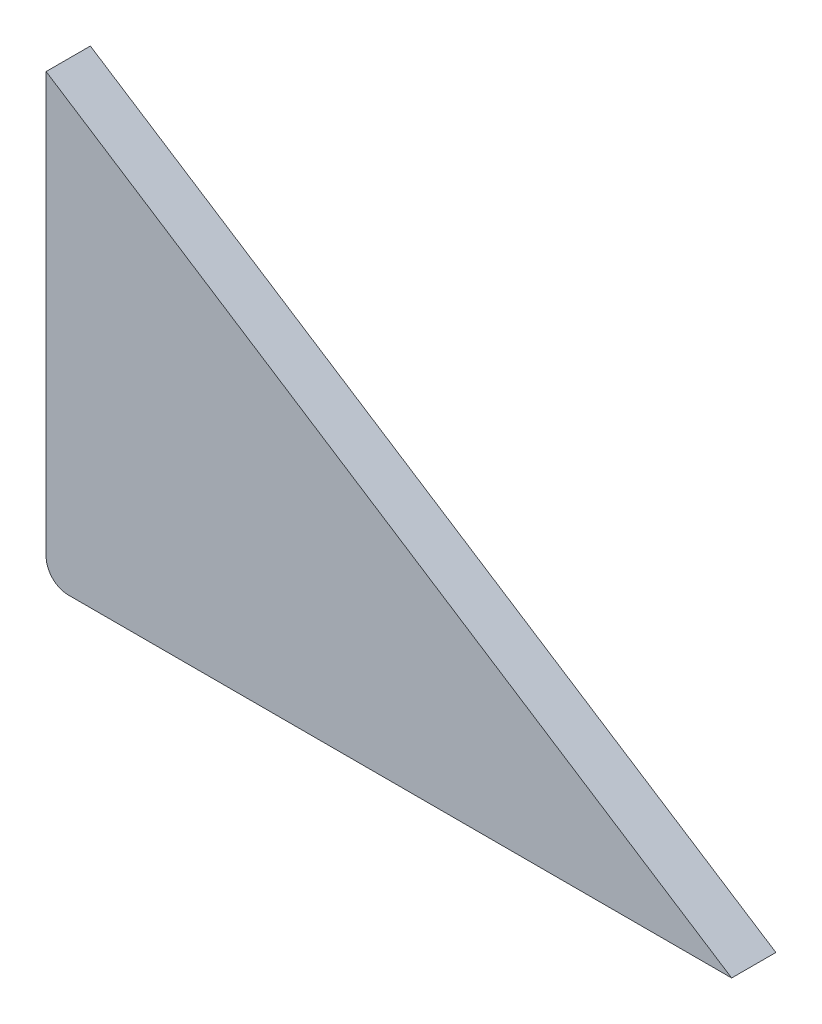
ISO-10303-21;
HEADER;
FILE_DESCRIPTION(('STEP AP214'),'2;1');
FILE_NAME('part.step','',(''),(''),'','','');
FILE_SCHEMA(('AUTOMOTIVE_DESIGN { 1 0 10303 214 1 1 1 1 }'));
ENDSEC;
DATA;
#1=APPLICATION_CONTEXT('core data for automotive mechanical design processes');
#2=APPLICATION_PROTOCOL_DEFINITION('international standard','automotive_design',2000,#1);
#3=PRODUCT_CONTEXT('',#1,'mechanical');
#4=PRODUCT('Part','Part','',(#3));
#5=PRODUCT_RELATED_PRODUCT_CATEGORY('part','',(#4));
#6=PRODUCT_DEFINITION_FORMATION('','',#4);
#7=PRODUCT_DEFINITION_CONTEXT('part definition',#1,'design');
#8=PRODUCT_DEFINITION('design','',#6,#7);
#9=PRODUCT_DEFINITION_SHAPE('','',#8);
#10=(LENGTH_UNIT() NAMED_UNIT(*) SI_UNIT(.MILLI.,.METRE.));
#11=(NAMED_UNIT(*) PLANE_ANGLE_UNIT() SI_UNIT($,.RADIAN.));
#12=(NAMED_UNIT(*) SI_UNIT($,.STERADIAN.) SOLID_ANGLE_UNIT());
#13=UNCERTAINTY_MEASURE_WITH_UNIT(LENGTH_MEASURE(1.E-05),#10,'distance_accuracy_value','');
#14=(GEOMETRIC_REPRESENTATION_CONTEXT(3) GLOBAL_UNCERTAINTY_ASSIGNED_CONTEXT((#13)) GLOBAL_UNIT_ASSIGNED_CONTEXT((#10,
#11,#12)) REPRESENTATION_CONTEXT('',''));
#15=CARTESIAN_POINT('',(0.,0.,0.));
#16=DIRECTION('',(0.,0.,1.));
#17=DIRECTION('',(1.,0.,0.));
#18=AXIS2_PLACEMENT_3D('',#15,#16,#17);
#19=CARTESIAN_POINT('',(0.,63.5,6.34999999999997));
#20=DIRECTION('',(1.,0.,0.));
#21=DIRECTION('',(0.,1.,0.));
#22=AXIS2_PLACEMENT_3D('',#19,#20,#21);
#23=PLANE('',#22);
#24=DIRECTION('',(0.,-1.,0.));
#25=VECTOR('',#24,1.);
#26=CARTESIAN_POINT('',(0.,63.5,0.));
#27=LINE('',#26,#25);
#28=CARTESIAN_POINT('',(0.,63.5,0.));
#29=VERTEX_POINT('',#28);
#30=CARTESIAN_POINT('',(0.,3.17499999999998,0.));
#31=VERTEX_POINT('',#30);
#32=EDGE_CURVE('E114',#29,#31,#27,.T.);
#33=ORIENTED_EDGE('',*,*,#32,.T.);
#34=DIRECTION('',(0.,0.,-1.));
#35=VECTOR('',#34,1.);
#36=CARTESIAN_POINT('',(0.,3.17499999999998,6.34999999999997));
#37=LINE('',#36,#35);
#38=CARTESIAN_POINT('',(0.,3.17499999999998,6.34999999999997));
#39=VERTEX_POINT('',#38);
#40=EDGE_CURVE('E49',#31,#39,#37,.F.);
#41=ORIENTED_EDGE('',*,*,#40,.T.);
#42=DIRECTION('',(0.,-1.,0.));
#43=VECTOR('',#42,1.);
#44=CARTESIAN_POINT('',(0.,63.5,6.34999999999997));
#45=LINE('',#44,#43);
#46=CARTESIAN_POINT('',(0.,63.5,6.34999999999997));
#47=VERTEX_POINT('',#46);
#48=EDGE_CURVE('E92',#47,#39,#45,.T.);
#49=ORIENTED_EDGE('',*,*,#48,.F.);
#50=DIRECTION('',(0.,0.,-1.));
#51=VECTOR('',#50,1.);
#52=CARTESIAN_POINT('',(0.,63.5,6.34999999999997));
#53=LINE('',#52,#51);
#54=EDGE_CURVE('E102',#47,#29,#53,.T.);
#55=ORIENTED_EDGE('',*,*,#54,.T.);
#56=EDGE_LOOP('',(#33,#41,#49,#55));
#57=FACE_BOUND('',#56,.T.);
#58=ADVANCED_FACE('F40',(#57),#23,.F.);
#59=CARTESIAN_POINT('',(0.,0.,6.34999999999997));
#60=DIRECTION('',(0.,1.,0.));
#61=DIRECTION('',(0.,0.,1.));
#62=AXIS2_PLACEMENT_3D('',#59,#60,#61);
#63=PLANE('',#62);
#64=DIRECTION('',(1.,0.,0.));
#65=VECTOR('',#64,1.);
#66=CARTESIAN_POINT('',(0.,0.,6.34999999999997));
#67=LINE('',#66,#65);
#68=CARTESIAN_POINT('',(3.175,0.,6.34999999999997));
#69=VERTEX_POINT('',#68);
#70=CARTESIAN_POINT('',(98.425,0.,6.34999999999997));
#71=VERTEX_POINT('',#70);
#72=EDGE_CURVE('E81',#69,#71,#67,.T.);
#73=ORIENTED_EDGE('',*,*,#72,.F.);
#74=DIRECTION('',(0.,0.,-1.));
#75=VECTOR('',#74,1.);
#76=CARTESIAN_POINT('',(3.175,0.,6.34999999999997));
#77=LINE('',#76,#75);
#78=CARTESIAN_POINT('',(3.175,0.,0.));
#79=VERTEX_POINT('',#78);
#80=EDGE_CURVE('E101',#69,#79,#77,.T.);
#81=ORIENTED_EDGE('',*,*,#80,.T.);
#82=DIRECTION('',(1.,0.,0.));
#83=VECTOR('',#82,1.);
#84=CARTESIAN_POINT('',(0.,0.,0.));
#85=LINE('',#84,#83);
#86=CARTESIAN_POINT('',(98.425,0.,0.));
#87=VERTEX_POINT('',#86);
#88=EDGE_CURVE('E97',#79,#87,#85,.T.);
#89=ORIENTED_EDGE('',*,*,#88,.T.);
#90=DIRECTION('',(0.,0.,-1.));
#91=VECTOR('',#90,1.);
#92=CARTESIAN_POINT('',(98.425,0.,6.34999999999997));
#93=LINE('',#92,#91);
#94=EDGE_CURVE('E95',#71,#87,#93,.T.);
#95=ORIENTED_EDGE('',*,*,#94,.F.);
#96=EDGE_LOOP('',(#73,#81,#89,#95));
#97=FACE_BOUND('',#96,.T.);
#98=ADVANCED_FACE('F96',(#97),#63,.F.);
#99=CARTESIAN_POINT('',(98.425,0.,6.34999999999997));
#100=DIRECTION('',(-0.542126869822093,-0.840296648224244,0.));
#101=DIRECTION('',(0.840296648224244,-0.542126869822093,0.));
#102=AXIS2_PLACEMENT_3D('',#99,#100,#101);
#103=PLANE('',#102);
#104=DIRECTION('',(-0.840296648224244,0.542126869822093,0.));
#105=VECTOR('',#104,1.);
#106=CARTESIAN_POINT('',(98.425,0.,0.));
#107=LINE('',#106,#105);
#108=EDGE_CURVE('E119',#87,#29,#107,.T.);
#109=ORIENTED_EDGE('',*,*,#108,.T.);
#110=ORIENTED_EDGE('',*,*,#54,.F.);
#111=DIRECTION('',(-0.840296648224244,0.542126869822093,0.));
#112=VECTOR('',#111,1.);
#113=CARTESIAN_POINT('',(98.425,0.,6.34999999999997));
#114=LINE('',#113,#112);
#115=EDGE_CURVE('E85',#71,#47,#114,.T.);
#116=ORIENTED_EDGE('',*,*,#115,.F.);
#117=ORIENTED_EDGE('',*,*,#94,.T.);
#118=EDGE_LOOP('',(#109,#110,#116,#117));
#119=FACE_BOUND('',#118,.T.);
#120=ADVANCED_FACE('F104',(#119),#103,.F.);
#121=CARTESIAN_POINT('',(0.,0.,6.34999999999997));
#122=DIRECTION('',(0.,0.,1.));
#123=DIRECTION('',(1.,0.,0.));
#124=AXIS2_PLACEMENT_3D('',#121,#122,#123);
#125=PLANE('',#124);
#126=ORIENTED_EDGE('',*,*,#48,.T.);
#127=CARTESIAN_POINT('',(3.175,3.17500000000001,6.34999999999997));
#128=DIRECTION('',(0.,0.,1.));
#129=DIRECTION('',(1.,0.,0.));
#130=AXIS2_PLACEMENT_3D('',#127,#128,#129);
#131=CIRCLE('',#130,3.175);
#132=EDGE_CURVE('E11',#39,#69,#131,.T.);
#133=ORIENTED_EDGE('',*,*,#132,.T.);
#134=ORIENTED_EDGE('',*,*,#72,.T.);
#135=ORIENTED_EDGE('',*,*,#115,.T.);
#136=EDGE_LOOP('',(#126,#133,#134,#135));
#137=FACE_BOUND('',#136,.T.);
#138=ADVANCED_FACE('F83',(#137),#125,.T.);
#139=CARTESIAN_POINT('',(0.,0.,0.));
#140=DIRECTION('',(0.,0.,1.));
#141=DIRECTION('',(1.,0.,0.));
#142=AXIS2_PLACEMENT_3D('',#139,#140,#141);
#143=PLANE('',#142);
#144=ORIENTED_EDGE('',*,*,#88,.F.);
#145=CARTESIAN_POINT('',(3.175,3.17500000000001,0.));
#146=DIRECTION('',(0.,0.,1.));
#147=DIRECTION('',(1.,0.,0.));
#148=AXIS2_PLACEMENT_3D('',#145,#146,#147);
#149=CIRCLE('',#148,3.175);
#150=EDGE_CURVE('E63',#79,#31,#149,.F.);
#151=ORIENTED_EDGE('',*,*,#150,.T.);
#152=ORIENTED_EDGE('',*,*,#32,.F.);
#153=ORIENTED_EDGE('',*,*,#108,.F.);
#154=EDGE_LOOP('',(#144,#151,#152,#153));
#155=FACE_BOUND('',#154,.T.);
#156=ADVANCED_FACE('F126',(#155),#143,.F.);
#157=CARTESIAN_POINT('',(3.175,3.17500000000001,6.34999999999997));
#158=DIRECTION('',(0.,0.,-1.));
#159=DIRECTION('',(-1.,0.,0.));
#160=AXIS2_PLACEMENT_3D('',#157,#158,#159);
#161=CYLINDRICAL_SURFACE('',#160,3.175);
#162=ORIENTED_EDGE('',*,*,#132,.F.);
#163=ORIENTED_EDGE('',*,*,#40,.F.);
#164=ORIENTED_EDGE('',*,*,#150,.F.);
#165=ORIENTED_EDGE('',*,*,#80,.F.);
#166=EDGE_LOOP('',(#162,#163,#164,#165));
#167=FACE_BOUND('',#166,.T.);
#168=ADVANCED_FACE('F42',(#167),#161,.T.);
#169=CLOSED_SHELL('',(#58,#98,#120,#138,#156,#168));
#170=MANIFOLD_SOLID_BREP('B2',#169);
#171=ADVANCED_BREP_SHAPE_REPRESENTATION('',(#18,#170),#14);
#172=SHAPE_DEFINITION_REPRESENTATION(#9,#171);
ENDSEC;
END-ISO-10303-21;
